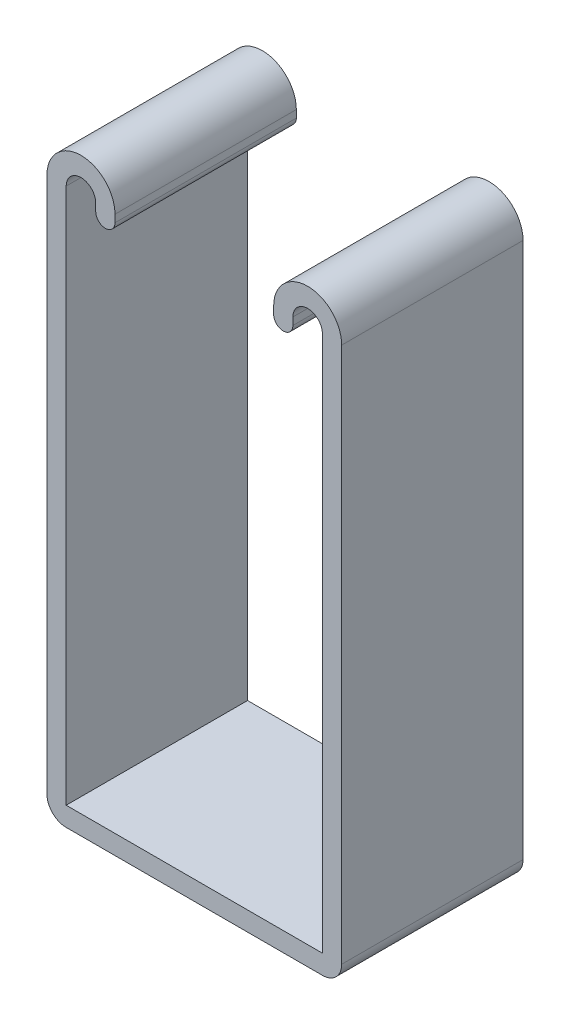
ISO-10303-21;
HEADER;
FILE_DESCRIPTION(('STEP AP214'),'2;1');
FILE_NAME('part.step','',(''),(''),'','','');
FILE_SCHEMA(('AUTOMOTIVE_DESIGN { 1 0 10303 214 1 1 1 1 }'));
ENDSEC;
DATA;
#1=APPLICATION_CONTEXT('core data for automotive mechanical design processes');
#2=APPLICATION_PROTOCOL_DEFINITION('international standard','automotive_design',2000,#1);
#3=PRODUCT_CONTEXT('',#1,'mechanical');
#4=PRODUCT('Part','Part','',(#3));
#5=PRODUCT_RELATED_PRODUCT_CATEGORY('part','',(#4));
#6=PRODUCT_DEFINITION_FORMATION('','',#4);
#7=PRODUCT_DEFINITION_CONTEXT('part definition',#1,'design');
#8=PRODUCT_DEFINITION('design','',#6,#7);
#9=PRODUCT_DEFINITION_SHAPE('','',#8);
#10=(LENGTH_UNIT() NAMED_UNIT(*) SI_UNIT(.MILLI.,.METRE.));
#11=(NAMED_UNIT(*) PLANE_ANGLE_UNIT() SI_UNIT($,.RADIAN.));
#12=(NAMED_UNIT(*) SI_UNIT($,.STERADIAN.) SOLID_ANGLE_UNIT());
#13=UNCERTAINTY_MEASURE_WITH_UNIT(LENGTH_MEASURE(1.E-05),#10,'distance_accuracy_value','');
#14=(GEOMETRIC_REPRESENTATION_CONTEXT(3) GLOBAL_UNCERTAINTY_ASSIGNED_CONTEXT((#13)) GLOBAL_UNIT_ASSIGNED_CONTEXT((#10,
#11,#12)) REPRESENTATION_CONTEXT('',''));
#15=CARTESIAN_POINT('',(0.,0.,0.));
#16=DIRECTION('',(0.,0.,1.));
#17=DIRECTION('',(1.,0.,0.));
#18=AXIS2_PLACEMENT_3D('',#15,#16,#17);
#19=CARTESIAN_POINT('',(-15.875,39.6875,12.7));
#20=DIRECTION('',(0.,0.,-1.));
#21=DIRECTION('',(-1.,0.,0.));
#22=AXIS2_PLACEMENT_3D('',#19,#20,#21);
#23=CYLINDRICAL_SURFACE('',#22,4.7625);
#24=CARTESIAN_POINT('',(-15.875,39.6875,-12.7));
#25=DIRECTION('',(0.,0.,1.));
#26=DIRECTION('',(-1.,0.,0.));
#27=AXIS2_PLACEMENT_3D('',#24,#25,#26);
#28=CIRCLE('',#27,4.7625);
#29=CARTESIAN_POINT('',(-11.1125,39.6875,-12.7));
#30=VERTEX_POINT('',#29);
#31=CARTESIAN_POINT('',(-20.6375,39.6875,-12.7));
#32=VERTEX_POINT('',#31);
#33=EDGE_CURVE('E188',#30,#32,#28,.T.);
#34=ORIENTED_EDGE('',*,*,#33,.T.);
#35=DIRECTION('',(0.,0.,-1.));
#36=VECTOR('',#35,1.);
#37=CARTESIAN_POINT('',(-20.6375,39.6875,12.7));
#38=LINE('',#37,#36);
#39=CARTESIAN_POINT('',(-20.6375,39.6875,12.7));
#40=VERTEX_POINT('',#39);
#41=EDGE_CURVE('E11',#40,#32,#38,.T.);
#42=ORIENTED_EDGE('',*,*,#41,.F.);
#43=CARTESIAN_POINT('',(-15.875,39.6875,12.7));
#44=DIRECTION('',(0.,0.,1.));
#45=DIRECTION('',(-1.,0.,0.));
#46=AXIS2_PLACEMENT_3D('',#43,#44,#45);
#47=CIRCLE('',#46,4.7625);
#48=CARTESIAN_POINT('',(-11.1125,39.6875,12.7));
#49=VERTEX_POINT('',#48);
#50=EDGE_CURVE('E222',#49,#40,#47,.T.);
#51=ORIENTED_EDGE('',*,*,#50,.F.);
#52=DIRECTION('',(0.,0.,-1.));
#53=VECTOR('',#52,1.);
#54=CARTESIAN_POINT('',(-11.1125,39.6875,12.7));
#55=LINE('',#54,#53);
#56=EDGE_CURVE('E184',#49,#30,#55,.T.);
#57=ORIENTED_EDGE('',*,*,#56,.T.);
#58=EDGE_LOOP('',(#34,#42,#51,#57));
#59=FACE_BOUND('',#58,.T.);
#60=ADVANCED_FACE('F32',(#59),#23,.T.);
#61=CARTESIAN_POINT('',(-20.6375,39.6875,12.7));
#62=DIRECTION('',(1.,0.,0.));
#63=DIRECTION('',(0.,1.,0.));
#64=AXIS2_PLACEMENT_3D('',#61,#62,#63);
#65=PLANE('',#64);
#66=DIRECTION('',(0.,-1.,0.));
#67=VECTOR('',#66,1.);
#68=CARTESIAN_POINT('',(-20.6375,39.6875,-12.7));
#69=LINE('',#68,#67);
#70=CARTESIAN_POINT('',(-20.6375,-35.4076,-12.7));
#71=VERTEX_POINT('',#70);
#72=EDGE_CURVE('E191',#32,#71,#69,.T.);
#73=ORIENTED_EDGE('',*,*,#72,.T.);
#74=DIRECTION('',(0.,0.,-1.));
#75=VECTOR('',#74,1.);
#76=CARTESIAN_POINT('',(-20.6375,-35.4076,12.7));
#77=LINE('',#76,#75);
#78=CARTESIAN_POINT('',(-20.6375,-35.4076,12.7));
#79=VERTEX_POINT('',#78);
#80=EDGE_CURVE('E40',#79,#71,#77,.T.);
#81=ORIENTED_EDGE('',*,*,#80,.F.);
#82=DIRECTION('',(0.,-1.,0.));
#83=VECTOR('',#82,1.);
#84=CARTESIAN_POINT('',(-20.6375,39.6875,12.7));
#85=LINE('',#84,#83);
#86=EDGE_CURVE('E121',#40,#79,#85,.T.);
#87=ORIENTED_EDGE('',*,*,#86,.F.);
#88=ORIENTED_EDGE('',*,*,#41,.T.);
#89=EDGE_LOOP('',(#73,#81,#87,#88));
#90=FACE_BOUND('',#89,.T.);
#91=ADVANCED_FACE('F330',(#90),#65,.F.);
#92=CARTESIAN_POINT('',(-17.9451,-35.4076,12.7));
#93=DIRECTION('',(0.,0.,-1.));
#94=DIRECTION('',(-1.,0.,0.));
#95=AXIS2_PLACEMENT_3D('',#92,#93,#94);
#96=CYLINDRICAL_SURFACE('',#95,2.6924);
#97=CARTESIAN_POINT('',(-17.9451,-35.4076,-12.7));
#98=DIRECTION('',(0.,0.,1.));
#99=DIRECTION('',(-1.,0.,0.));
#100=AXIS2_PLACEMENT_3D('',#97,#98,#99);
#101=CIRCLE('',#100,2.6924);
#102=CARTESIAN_POINT('',(-17.9451,-38.1,-12.7));
#103=VERTEX_POINT('',#102);
#104=EDGE_CURVE('E193',#71,#103,#101,.T.);
#105=ORIENTED_EDGE('',*,*,#104,.T.);
#106=DIRECTION('',(0.,0.,-1.));
#107=VECTOR('',#106,1.);
#108=CARTESIAN_POINT('',(-17.9451,-38.1,12.7));
#109=LINE('',#108,#107);
#110=CARTESIAN_POINT('',(-17.9451,-38.1,12.7));
#111=VERTEX_POINT('',#110);
#112=EDGE_CURVE('E259',#111,#103,#109,.T.);
#113=ORIENTED_EDGE('',*,*,#112,.F.);
#114=CARTESIAN_POINT('',(-17.9451,-35.4076,12.7));
#115=DIRECTION('',(0.,0.,1.));
#116=DIRECTION('',(-1.,0.,0.));
#117=AXIS2_PLACEMENT_3D('',#114,#115,#116);
#118=CIRCLE('',#117,2.6924);
#119=EDGE_CURVE('E267',#79,#111,#118,.T.);
#120=ORIENTED_EDGE('',*,*,#119,.F.);
#121=ORIENTED_EDGE('',*,*,#80,.T.);
#122=EDGE_LOOP('',(#105,#113,#120,#121));
#123=FACE_BOUND('',#122,.T.);
#124=ADVANCED_FACE('F265',(#123),#96,.T.);
#125=CARTESIAN_POINT('',(-17.9451,-38.1,12.7));
#126=DIRECTION('',(0.,1.,0.));
#127=DIRECTION('',(-1.,0.,0.));
#128=AXIS2_PLACEMENT_3D('',#125,#126,#127);
#129=PLANE('',#128);
#130=DIRECTION('',(1.,0.,0.));
#131=VECTOR('',#130,1.);
#132=CARTESIAN_POINT('',(-17.9451,-38.1,-12.7));
#133=LINE('',#132,#131);
#134=CARTESIAN_POINT('',(17.9451,-38.1,-12.7));
#135=VERTEX_POINT('',#134);
#136=EDGE_CURVE('E195',#103,#135,#133,.T.);
#137=ORIENTED_EDGE('',*,*,#136,.T.);
#138=DIRECTION('',(0.,0.,-1.));
#139=VECTOR('',#138,1.);
#140=CARTESIAN_POINT('',(17.9451,-38.1,12.7));
#141=LINE('',#140,#139);
#142=CARTESIAN_POINT('',(17.9451,-38.1,12.7));
#143=VERTEX_POINT('',#142);
#144=EDGE_CURVE('E256',#143,#135,#141,.T.);
#145=ORIENTED_EDGE('',*,*,#144,.F.);
#146=DIRECTION('',(1.,0.,0.));
#147=VECTOR('',#146,1.);
#148=CARTESIAN_POINT('',(-17.9451,-38.1,12.7));
#149=LINE('',#148,#147);
#150=EDGE_CURVE('E285',#111,#143,#149,.T.);
#151=ORIENTED_EDGE('',*,*,#150,.F.);
#152=ORIENTED_EDGE('',*,*,#112,.T.);
#153=EDGE_LOOP('',(#137,#145,#151,#152));
#154=FACE_BOUND('',#153,.T.);
#155=ADVANCED_FACE('F276',(#154),#129,.F.);
#156=CARTESIAN_POINT('',(17.9451,-35.4076,12.7));
#157=DIRECTION('',(0.,0.,-1.));
#158=DIRECTION('',(-1.,0.,0.));
#159=AXIS2_PLACEMENT_3D('',#156,#157,#158);
#160=CYLINDRICAL_SURFACE('',#159,2.6924);
#161=CARTESIAN_POINT('',(17.9451,-35.4076,-12.7));
#162=DIRECTION('',(0.,0.,1.));
#163=DIRECTION('',(1.,0.,0.));
#164=AXIS2_PLACEMENT_3D('',#161,#162,#163);
#165=CIRCLE('',#164,2.6924);
#166=CARTESIAN_POINT('',(20.6375,-35.4076,-12.7));
#167=VERTEX_POINT('',#166);
#168=EDGE_CURVE('E197',#135,#167,#165,.T.);
#169=ORIENTED_EDGE('',*,*,#168,.T.);
#170=DIRECTION('',(0.,0.,-1.));
#171=VECTOR('',#170,1.);
#172=CARTESIAN_POINT('',(20.6375,-35.4076,12.7));
#173=LINE('',#172,#171);
#174=CARTESIAN_POINT('',(20.6375,-35.4076,12.7));
#175=VERTEX_POINT('',#174);
#176=EDGE_CURVE('E253',#175,#167,#173,.T.);
#177=ORIENTED_EDGE('',*,*,#176,.F.);
#178=CARTESIAN_POINT('',(17.9451,-35.4076,12.7));
#179=DIRECTION('',(0.,0.,1.));
#180=DIRECTION('',(1.,0.,0.));
#181=AXIS2_PLACEMENT_3D('',#178,#179,#180);
#182=CIRCLE('',#181,2.6924);
#183=EDGE_CURVE('E282',#143,#175,#182,.T.);
#184=ORIENTED_EDGE('',*,*,#183,.F.);
#185=ORIENTED_EDGE('',*,*,#144,.T.);
#186=EDGE_LOOP('',(#169,#177,#184,#185));
#187=FACE_BOUND('',#186,.T.);
#188=ADVANCED_FACE('F280',(#187),#160,.T.);
#189=CARTESIAN_POINT('',(20.6375,-35.4076,12.7));
#190=DIRECTION('',(-1.,0.,0.));
#191=DIRECTION('',(0.,-1.,0.));
#192=AXIS2_PLACEMENT_3D('',#189,#190,#191);
#193=PLANE('',#192);
#194=DIRECTION('',(0.,1.,0.));
#195=VECTOR('',#194,1.);
#196=CARTESIAN_POINT('',(20.6375,-35.4076,-12.7));
#197=LINE('',#196,#195);
#198=CARTESIAN_POINT('',(20.6375,39.6875,-12.7));
#199=VERTEX_POINT('',#198);
#200=EDGE_CURVE('E199',#167,#199,#197,.T.);
#201=ORIENTED_EDGE('',*,*,#200,.T.);
#202=DIRECTION('',(0.,0.,-1.));
#203=VECTOR('',#202,1.);
#204=CARTESIAN_POINT('',(20.6375,39.6875,12.7));
#205=LINE('',#204,#203);
#206=CARTESIAN_POINT('',(20.6375,39.6875,12.7));
#207=VERTEX_POINT('',#206);
#208=EDGE_CURVE('E250',#207,#199,#205,.T.);
#209=ORIENTED_EDGE('',*,*,#208,.F.);
#210=DIRECTION('',(0.,1.,0.));
#211=VECTOR('',#210,1.);
#212=CARTESIAN_POINT('',(20.6375,-35.4076,12.7));
#213=LINE('',#212,#211);
#214=EDGE_CURVE('E284',#175,#207,#213,.T.);
#215=ORIENTED_EDGE('',*,*,#214,.F.);
#216=ORIENTED_EDGE('',*,*,#176,.T.);
#217=EDGE_LOOP('',(#201,#209,#215,#216));
#218=FACE_BOUND('',#217,.T.);
#219=ADVANCED_FACE('F343',(#218),#193,.F.);
#220=CARTESIAN_POINT('',(15.875,39.6875,12.7));
#221=DIRECTION('',(0.,0.,-1.));
#222=DIRECTION('',(-1.,0.,0.));
#223=AXIS2_PLACEMENT_3D('',#220,#221,#222);
#224=CYLINDRICAL_SURFACE('',#223,4.7625);
#225=CARTESIAN_POINT('',(15.875,39.6875,-12.7));
#226=DIRECTION('',(0.,0.,1.));
#227=DIRECTION('',(1.,0.,0.));
#228=AXIS2_PLACEMENT_3D('',#225,#226,#227);
#229=CIRCLE('',#228,4.7625);
#230=CARTESIAN_POINT('',(11.1125,39.6875,-12.7));
#231=VERTEX_POINT('',#230);
#232=EDGE_CURVE('E201',#199,#231,#229,.T.);
#233=ORIENTED_EDGE('',*,*,#232,.T.);
#234=DIRECTION('',(0.,0.,-1.));
#235=VECTOR('',#234,1.);
#236=CARTESIAN_POINT('',(11.1125,39.6875,12.7));
#237=LINE('',#236,#235);
#238=CARTESIAN_POINT('',(11.1125,39.6875,12.7));
#239=VERTEX_POINT('',#238);
#240=EDGE_CURVE('E247',#239,#231,#237,.T.);
#241=ORIENTED_EDGE('',*,*,#240,.F.);
#242=CARTESIAN_POINT('',(15.875,39.6875,12.7));
#243=DIRECTION('',(0.,0.,1.));
#244=DIRECTION('',(1.,0.,0.));
#245=AXIS2_PLACEMENT_3D('',#242,#243,#244);
#246=CIRCLE('',#245,4.7625);
#247=EDGE_CURVE('E287',#207,#239,#246,.T.);
#248=ORIENTED_EDGE('',*,*,#247,.F.);
#249=ORIENTED_EDGE('',*,*,#208,.T.);
#250=EDGE_LOOP('',(#233,#241,#248,#249));
#251=FACE_BOUND('',#250,.T.);
#252=ADVANCED_FACE('F346',(#251),#224,.T.);
#253=CARTESIAN_POINT('',(11.1125,39.6875,12.7));
#254=DIRECTION('',(1.,0.,0.));
#255=DIRECTION('',(0.,1.,0.));
#256=AXIS2_PLACEMENT_3D('',#253,#254,#255);
#257=PLANE('',#256);
#258=DIRECTION('',(0.,-1.,0.));
#259=VECTOR('',#258,1.);
#260=CARTESIAN_POINT('',(11.1125,39.6875,-12.7));
#261=LINE('',#260,#259);
#262=CARTESIAN_POINT('',(11.1125,38.65245,-12.7));
#263=VERTEX_POINT('',#262);
#264=EDGE_CURVE('E203',#231,#263,#261,.T.);
#265=ORIENTED_EDGE('',*,*,#264,.T.);
#266=DIRECTION('',(0.,0.,-1.));
#267=VECTOR('',#266,1.);
#268=CARTESIAN_POINT('',(11.1125,38.65245,12.7));
#269=LINE('',#268,#267);
#270=CARTESIAN_POINT('',(11.1125,38.65245,12.7));
#271=VERTEX_POINT('',#270);
#272=EDGE_CURVE('E244',#271,#263,#269,.T.);
#273=ORIENTED_EDGE('',*,*,#272,.F.);
#274=DIRECTION('',(0.,-1.,0.));
#275=VECTOR('',#274,1.);
#276=CARTESIAN_POINT('',(11.1125,39.6875,12.7));
#277=LINE('',#276,#275);
#278=EDGE_CURVE('E293',#239,#271,#277,.T.);
#279=ORIENTED_EDGE('',*,*,#278,.F.);
#280=ORIENTED_EDGE('',*,*,#240,.T.);
#281=EDGE_LOOP('',(#265,#273,#279,#280));
#282=FACE_BOUND('',#281,.T.);
#283=ADVANCED_FACE('F350',(#282),#257,.F.);
#284=CARTESIAN_POINT('',(12.4587,38.65245,12.7));
#285=DIRECTION('',(0.,0.,-1.));
#286=DIRECTION('',(-1.,0.,0.));
#287=AXIS2_PLACEMENT_3D('',#284,#285,#286);
#288=CYLINDRICAL_SURFACE('',#287,1.3462);
#289=CARTESIAN_POINT('',(12.4587,38.65245,-12.7));
#290=DIRECTION('',(0.,0.,1.));
#291=DIRECTION('',(1.,0.,0.));
#292=AXIS2_PLACEMENT_3D('',#289,#290,#291);
#293=CIRCLE('',#292,1.3462);
#294=CARTESIAN_POINT('',(13.8049,38.65245,-12.7));
#295=VERTEX_POINT('',#294);
#296=EDGE_CURVE('E205',#263,#295,#293,.T.);
#297=ORIENTED_EDGE('',*,*,#296,.T.);
#298=DIRECTION('',(0.,0.,-1.));
#299=VECTOR('',#298,1.);
#300=CARTESIAN_POINT('',(13.8049,38.65245,12.7));
#301=LINE('',#300,#299);
#302=CARTESIAN_POINT('',(13.8049,38.65245,12.7));
#303=VERTEX_POINT('',#302);
#304=EDGE_CURVE('E241',#303,#295,#301,.T.);
#305=ORIENTED_EDGE('',*,*,#304,.F.);
#306=CARTESIAN_POINT('',(12.4587,38.65245,12.7));
#307=DIRECTION('',(0.,0.,1.));
#308=DIRECTION('',(1.,0.,0.));
#309=AXIS2_PLACEMENT_3D('',#306,#307,#308);
#310=CIRCLE('',#309,1.3462);
#311=EDGE_CURVE('E295',#271,#303,#310,.T.);
#312=ORIENTED_EDGE('',*,*,#311,.F.);
#313=ORIENTED_EDGE('',*,*,#272,.T.);
#314=EDGE_LOOP('',(#297,#305,#312,#313));
#315=FACE_BOUND('',#314,.T.);
#316=ADVANCED_FACE('F354',(#315),#288,.T.);
#317=CARTESIAN_POINT('',(13.8049,39.6875,12.7));
#318=DIRECTION('',(-1.,0.,0.));
#319=DIRECTION('',(0.,0.,1.));
#320=AXIS2_PLACEMENT_3D('',#317,#318,#319);
#321=PLANE('',#320);
#322=DIRECTION('',(0.,1.,0.));
#323=VECTOR('',#322,1.);
#324=CARTESIAN_POINT('',(13.8049,39.6875,-12.7));
#325=LINE('',#324,#323);
#326=CARTESIAN_POINT('',(13.8049,39.6875,-12.7));
#327=VERTEX_POINT('',#326);
#328=EDGE_CURVE('E207',#295,#327,#325,.T.);
#329=ORIENTED_EDGE('',*,*,#328,.T.);
#330=DIRECTION('',(0.,0.,-1.));
#331=VECTOR('',#330,1.);
#332=CARTESIAN_POINT('',(13.8049,39.6875,12.7));
#333=LINE('',#332,#331);
#334=CARTESIAN_POINT('',(13.8049,39.6875,12.7));
#335=VERTEX_POINT('',#334);
#336=EDGE_CURVE('E238',#335,#327,#333,.T.);
#337=ORIENTED_EDGE('',*,*,#336,.F.);
#338=DIRECTION('',(0.,1.,0.));
#339=VECTOR('',#338,1.);
#340=CARTESIAN_POINT('',(13.8049,39.6875,12.7));
#341=LINE('',#340,#339);
#342=EDGE_CURVE('E297',#303,#335,#341,.T.);
#343=ORIENTED_EDGE('',*,*,#342,.F.);
#344=ORIENTED_EDGE('',*,*,#304,.T.);
#345=EDGE_LOOP('',(#329,#337,#343,#344));
#346=FACE_BOUND('',#345,.T.);
#347=ADVANCED_FACE('F358',(#346),#321,.F.);
#348=CARTESIAN_POINT('',(15.875,39.6875,12.7));
#349=DIRECTION('',(0.,0.,-1.));
#350=DIRECTION('',(-1.,0.,0.));
#351=AXIS2_PLACEMENT_3D('',#348,#349,#350);
#352=CYLINDRICAL_SURFACE('',#351,2.07010000000001);
#353=CARTESIAN_POINT('',(15.875,39.6875,-12.7));
#354=DIRECTION('',(0.,0.,-1.));
#355=DIRECTION('',(1.,0.,0.));
#356=AXIS2_PLACEMENT_3D('',#353,#354,#355);
#357=CIRCLE('',#356,2.07010000000001);
#358=CARTESIAN_POINT('',(17.9451,39.6875,-12.7));
#359=VERTEX_POINT('',#358);
#360=EDGE_CURVE('E209',#327,#359,#357,.T.);
#361=ORIENTED_EDGE('',*,*,#360,.T.);
#362=DIRECTION('',(0.,0.,-1.));
#363=VECTOR('',#362,1.);
#364=CARTESIAN_POINT('',(17.9451,39.6875,12.7));
#365=LINE('',#364,#363);
#366=CARTESIAN_POINT('',(17.9451,39.6875,12.7));
#367=VERTEX_POINT('',#366);
#368=EDGE_CURVE('E235',#367,#359,#365,.T.);
#369=ORIENTED_EDGE('',*,*,#368,.F.);
#370=CARTESIAN_POINT('',(15.875,39.6875,12.7));
#371=DIRECTION('',(0.,0.,-1.));
#372=DIRECTION('',(1.,0.,0.));
#373=AXIS2_PLACEMENT_3D('',#370,#371,#372);
#374=CIRCLE('',#373,2.07010000000001);
#375=EDGE_CURVE('E299',#335,#367,#374,.T.);
#376=ORIENTED_EDGE('',*,*,#375,.F.);
#377=ORIENTED_EDGE('',*,*,#336,.T.);
#378=EDGE_LOOP('',(#361,#369,#376,#377));
#379=FACE_BOUND('',#378,.T.);
#380=ADVANCED_FACE('F362',(#379),#352,.F.);
#381=CARTESIAN_POINT('',(17.9451,-35.4076,12.7));
#382=DIRECTION('',(1.,0.,0.));
#383=DIRECTION('',(0.,0.,-1.));
#384=AXIS2_PLACEMENT_3D('',#381,#382,#383);
#385=PLANE('',#384);
#386=DIRECTION('',(0.,-1.,0.));
#387=VECTOR('',#386,1.);
#388=CARTESIAN_POINT('',(17.9451,-35.4076,-12.7));
#389=LINE('',#388,#387);
#390=CARTESIAN_POINT('',(17.9451,-35.4076,-12.7));
#391=VERTEX_POINT('',#390);
#392=EDGE_CURVE('E211',#359,#391,#389,.T.);
#393=ORIENTED_EDGE('',*,*,#392,.T.);
#394=DIRECTION('',(0.,0.,-1.));
#395=VECTOR('',#394,1.);
#396=CARTESIAN_POINT('',(17.9451,-35.4076,12.7));
#397=LINE('',#396,#395);
#398=CARTESIAN_POINT('',(17.9451,-35.4076,12.7));
#399=VERTEX_POINT('',#398);
#400=EDGE_CURVE('E232',#399,#391,#397,.T.);
#401=ORIENTED_EDGE('',*,*,#400,.F.);
#402=DIRECTION('',(0.,-1.,0.));
#403=VECTOR('',#402,1.);
#404=CARTESIAN_POINT('',(17.9451,-35.4076,12.7));
#405=LINE('',#404,#403);
#406=EDGE_CURVE('E301',#367,#399,#405,.T.);
#407=ORIENTED_EDGE('',*,*,#406,.F.);
#408=ORIENTED_EDGE('',*,*,#368,.T.);
#409=EDGE_LOOP('',(#393,#401,#407,#408));
#410=FACE_BOUND('',#409,.T.);
#411=ADVANCED_FACE('F366',(#410),#385,.F.);
#412=CARTESIAN_POINT('',(-17.9451,-35.4076,12.7));
#413=DIRECTION('',(0.,-1.,0.));
#414=DIRECTION('',(0.,0.,-1.));
#415=AXIS2_PLACEMENT_3D('',#412,#413,#414);
#416=PLANE('',#415);
#417=DIRECTION('',(-1.,0.,0.));
#418=VECTOR('',#417,1.);
#419=CARTESIAN_POINT('',(-17.9451,-35.4076,-12.7));
#420=LINE('',#419,#418);
#421=CARTESIAN_POINT('',(-17.9451,-35.4076,-12.7));
#422=VERTEX_POINT('',#421);
#423=EDGE_CURVE('E213',#391,#422,#420,.T.);
#424=ORIENTED_EDGE('',*,*,#423,.T.);
#425=DIRECTION('',(0.,0.,-1.));
#426=VECTOR('',#425,1.);
#427=CARTESIAN_POINT('',(-17.9451,-35.4076,12.7));
#428=LINE('',#427,#426);
#429=CARTESIAN_POINT('',(-17.9451,-35.4076,12.7));
#430=VERTEX_POINT('',#429);
#431=EDGE_CURVE('E229',#430,#422,#428,.T.);
#432=ORIENTED_EDGE('',*,*,#431,.F.);
#433=DIRECTION('',(-1.,0.,0.));
#434=VECTOR('',#433,1.);
#435=CARTESIAN_POINT('',(-17.9451,-35.4076,12.7));
#436=LINE('',#435,#434);
#437=EDGE_CURVE('E303',#399,#430,#436,.T.);
#438=ORIENTED_EDGE('',*,*,#437,.F.);
#439=ORIENTED_EDGE('',*,*,#400,.T.);
#440=EDGE_LOOP('',(#424,#432,#438,#439));
#441=FACE_BOUND('',#440,.T.);
#442=ADVANCED_FACE('F370',(#441),#416,.F.);
#443=CARTESIAN_POINT('',(-17.9451,39.6875,12.7));
#444=DIRECTION('',(-1.,0.,0.));
#445=DIRECTION('',(0.,-1.,0.));
#446=AXIS2_PLACEMENT_3D('',#443,#444,#445);
#447=PLANE('',#446);
#448=DIRECTION('',(0.,1.,0.));
#449=VECTOR('',#448,1.);
#450=CARTESIAN_POINT('',(-17.9451,39.6875,-12.7));
#451=LINE('',#450,#449);
#452=CARTESIAN_POINT('',(-17.9451,39.6875,-12.7));
#453=VERTEX_POINT('',#452);
#454=EDGE_CURVE('E215',#422,#453,#451,.T.);
#455=ORIENTED_EDGE('',*,*,#454,.T.);
#456=DIRECTION('',(0.,0.,-1.));
#457=VECTOR('',#456,1.);
#458=CARTESIAN_POINT('',(-17.9451,39.6875,12.7));
#459=LINE('',#458,#457);
#460=CARTESIAN_POINT('',(-17.9451,39.6875,12.7));
#461=VERTEX_POINT('',#460);
#462=EDGE_CURVE('E226',#461,#453,#459,.T.);
#463=ORIENTED_EDGE('',*,*,#462,.F.);
#464=DIRECTION('',(0.,1.,0.));
#465=VECTOR('',#464,1.);
#466=CARTESIAN_POINT('',(-17.9451,39.6875,12.7));
#467=LINE('',#466,#465);
#468=EDGE_CURVE('E305',#430,#461,#467,.T.);
#469=ORIENTED_EDGE('',*,*,#468,.F.);
#470=ORIENTED_EDGE('',*,*,#431,.T.);
#471=EDGE_LOOP('',(#455,#463,#469,#470));
#472=FACE_BOUND('',#471,.T.);
#473=ADVANCED_FACE('F311',(#472),#447,.F.);
#474=CARTESIAN_POINT('',(-15.875,39.6875,12.7));
#475=DIRECTION('',(0.,0.,-1.));
#476=DIRECTION('',(-1.,0.,0.));
#477=AXIS2_PLACEMENT_3D('',#474,#475,#476);
#478=CYLINDRICAL_SURFACE('',#477,2.0701);
#479=CARTESIAN_POINT('',(-15.875,39.6875,-12.7));
#480=DIRECTION('',(0.,0.,-1.));
#481=DIRECTION('',(-1.,0.,0.));
#482=AXIS2_PLACEMENT_3D('',#479,#480,#481);
#483=CIRCLE('',#482,2.0701);
#484=CARTESIAN_POINT('',(-13.8049,39.6875,-12.7));
#485=VERTEX_POINT('',#484);
#486=EDGE_CURVE('E217',#453,#485,#483,.T.);
#487=ORIENTED_EDGE('',*,*,#486,.T.);
#488=DIRECTION('',(0.,0.,-1.));
#489=VECTOR('',#488,1.);
#490=CARTESIAN_POINT('',(-13.8049,39.6875,12.7));
#491=LINE('',#490,#489);
#492=CARTESIAN_POINT('',(-13.8049,39.6875,12.7));
#493=VERTEX_POINT('',#492);
#494=EDGE_CURVE('E179',#493,#485,#491,.T.);
#495=ORIENTED_EDGE('',*,*,#494,.F.);
#496=CARTESIAN_POINT('',(-15.875,39.6875,12.7));
#497=DIRECTION('',(0.,0.,-1.));
#498=DIRECTION('',(-1.,0.,0.));
#499=AXIS2_PLACEMENT_3D('',#496,#497,#498);
#500=CIRCLE('',#499,2.0701);
#501=EDGE_CURVE('E170',#461,#493,#500,.T.);
#502=ORIENTED_EDGE('',*,*,#501,.F.);
#503=ORIENTED_EDGE('',*,*,#462,.T.);
#504=EDGE_LOOP('',(#487,#495,#502,#503));
#505=FACE_BOUND('',#504,.T.);
#506=ADVANCED_FACE('F315',(#505),#478,.F.);
#507=CARTESIAN_POINT('',(-13.8049,39.6875,12.7));
#508=DIRECTION('',(1.,0.,0.));
#509=DIRECTION('',(0.,1.,0.));
#510=AXIS2_PLACEMENT_3D('',#507,#508,#509);
#511=PLANE('',#510);
#512=DIRECTION('',(0.,-1.,0.));
#513=VECTOR('',#512,1.);
#514=CARTESIAN_POINT('',(-13.8049,39.6875,-12.7));
#515=LINE('',#514,#513);
#516=CARTESIAN_POINT('',(-13.8049,38.65245,-12.7));
#517=VERTEX_POINT('',#516);
#518=EDGE_CURVE('E178',#485,#517,#515,.T.);
#519=ORIENTED_EDGE('',*,*,#518,.T.);
#520=DIRECTION('',(0.,0.,-1.));
#521=VECTOR('',#520,1.);
#522=CARTESIAN_POINT('',(-13.8049,38.65245,12.7));
#523=LINE('',#522,#521);
#524=CARTESIAN_POINT('',(-13.8049,38.65245,12.7));
#525=VERTEX_POINT('',#524);
#526=EDGE_CURVE('E175',#525,#517,#523,.T.);
#527=ORIENTED_EDGE('',*,*,#526,.F.);
#528=DIRECTION('',(0.,-1.,0.));
#529=VECTOR('',#528,1.);
#530=CARTESIAN_POINT('',(-13.8049,39.6875,12.7));
#531=LINE('',#530,#529);
#532=EDGE_CURVE('E164',#493,#525,#531,.T.);
#533=ORIENTED_EDGE('',*,*,#532,.F.);
#534=ORIENTED_EDGE('',*,*,#494,.T.);
#535=EDGE_LOOP('',(#519,#527,#533,#534));
#536=FACE_BOUND('',#535,.T.);
#537=ADVANCED_FACE('F176',(#536),#511,.F.);
#538=CARTESIAN_POINT('',(-12.4587,38.65245,12.7));
#539=DIRECTION('',(0.,0.,-1.));
#540=DIRECTION('',(-1.,0.,0.));
#541=AXIS2_PLACEMENT_3D('',#538,#539,#540);
#542=CYLINDRICAL_SURFACE('',#541,1.3462);
#543=CARTESIAN_POINT('',(-12.4587,38.65245,-12.7));
#544=DIRECTION('',(0.,0.,1.));
#545=DIRECTION('',(-1.,0.,0.));
#546=AXIS2_PLACEMENT_3D('',#543,#544,#545);
#547=CIRCLE('',#546,1.3462);
#548=CARTESIAN_POINT('',(-11.1125,38.65245,-12.7));
#549=VERTEX_POINT('',#548);
#550=EDGE_CURVE('E107',#517,#549,#547,.T.);
#551=ORIENTED_EDGE('',*,*,#550,.T.);
#552=DIRECTION('',(0.,0.,-1.));
#553=VECTOR('',#552,1.);
#554=CARTESIAN_POINT('',(-11.1125,38.65245,12.7));
#555=LINE('',#554,#553);
#556=CARTESIAN_POINT('',(-11.1125,38.65245,12.7));
#557=VERTEX_POINT('',#556);
#558=EDGE_CURVE('E180',#557,#549,#555,.T.);
#559=ORIENTED_EDGE('',*,*,#558,.F.);
#560=CARTESIAN_POINT('',(-12.4587,38.65245,12.7));
#561=DIRECTION('',(0.,0.,1.));
#562=DIRECTION('',(-1.,0.,0.));
#563=AXIS2_PLACEMENT_3D('',#560,#561,#562);
#564=CIRCLE('',#563,1.3462);
#565=EDGE_CURVE('E168',#525,#557,#564,.T.);
#566=ORIENTED_EDGE('',*,*,#565,.F.);
#567=ORIENTED_EDGE('',*,*,#526,.T.);
#568=EDGE_LOOP('',(#551,#559,#566,#567));
#569=FACE_BOUND('',#568,.T.);
#570=ADVANCED_FACE('F182',(#569),#542,.T.);
#571=CARTESIAN_POINT('',(-11.1125,39.6875,12.7));
#572=DIRECTION('',(-1.,0.,0.));
#573=DIRECTION('',(0.,-1.,0.));
#574=AXIS2_PLACEMENT_3D('',#571,#572,#573);
#575=PLANE('',#574);
#576=DIRECTION('',(0.,1.,0.));
#577=VECTOR('',#576,1.);
#578=CARTESIAN_POINT('',(-11.1125,39.6875,-12.7));
#579=LINE('',#578,#577);
#580=EDGE_CURVE('E113',#549,#30,#579,.T.);
#581=ORIENTED_EDGE('',*,*,#580,.T.);
#582=ORIENTED_EDGE('',*,*,#56,.F.);
#583=DIRECTION('',(0.,1.,0.));
#584=VECTOR('',#583,1.);
#585=CARTESIAN_POINT('',(-11.1125,39.6875,12.7));
#586=LINE('',#585,#584);
#587=EDGE_CURVE('E48',#557,#49,#586,.T.);
#588=ORIENTED_EDGE('',*,*,#587,.F.);
#589=ORIENTED_EDGE('',*,*,#558,.T.);
#590=EDGE_LOOP('',(#581,#582,#588,#589));
#591=FACE_BOUND('',#590,.T.);
#592=ADVANCED_FACE('F319',(#591),#575,.F.);
#593=CARTESIAN_POINT('',(-15.875,39.6875,12.7));
#594=DIRECTION('',(0.,0.,-1.));
#595=DIRECTION('',(-1.,0.,0.));
#596=AXIS2_PLACEMENT_3D('',#593,#594,#595);
#597=PLANE('',#596);
#598=ORIENTED_EDGE('',*,*,#50,.T.);
#599=ORIENTED_EDGE('',*,*,#86,.T.);
#600=ORIENTED_EDGE('',*,*,#119,.T.);
#601=ORIENTED_EDGE('',*,*,#150,.T.);
#602=ORIENTED_EDGE('',*,*,#183,.T.);
#603=ORIENTED_EDGE('',*,*,#214,.T.);
#604=ORIENTED_EDGE('',*,*,#247,.T.);
#605=ORIENTED_EDGE('',*,*,#278,.T.);
#606=ORIENTED_EDGE('',*,*,#311,.T.);
#607=ORIENTED_EDGE('',*,*,#342,.T.);
#608=ORIENTED_EDGE('',*,*,#375,.T.);
#609=ORIENTED_EDGE('',*,*,#406,.T.);
#610=ORIENTED_EDGE('',*,*,#437,.T.);
#611=ORIENTED_EDGE('',*,*,#468,.T.);
#612=ORIENTED_EDGE('',*,*,#501,.T.);
#613=ORIENTED_EDGE('',*,*,#532,.T.);
#614=ORIENTED_EDGE('',*,*,#565,.T.);
#615=ORIENTED_EDGE('',*,*,#587,.T.);
#616=EDGE_LOOP('',(#598,#599,#600,#601,#602,#603,#604,#605,#606,#607,#608,#609,#610,#611,#612,
#613,#614,#615));
#617=FACE_BOUND('',#616,.T.);
#618=ADVANCED_FACE('F166',(#617),#597,.F.);
#619=CARTESIAN_POINT('',(-15.875,39.6875,-12.7));
#620=DIRECTION('',(0.,0.,-1.));
#621=DIRECTION('',(-1.,0.,0.));
#622=AXIS2_PLACEMENT_3D('',#619,#620,#621);
#623=PLANE('',#622);
#624=ORIENTED_EDGE('',*,*,#33,.F.);
#625=ORIENTED_EDGE('',*,*,#580,.F.);
#626=ORIENTED_EDGE('',*,*,#550,.F.);
#627=ORIENTED_EDGE('',*,*,#518,.F.);
#628=ORIENTED_EDGE('',*,*,#486,.F.);
#629=ORIENTED_EDGE('',*,*,#454,.F.);
#630=ORIENTED_EDGE('',*,*,#423,.F.);
#631=ORIENTED_EDGE('',*,*,#392,.F.);
#632=ORIENTED_EDGE('',*,*,#360,.F.);
#633=ORIENTED_EDGE('',*,*,#328,.F.);
#634=ORIENTED_EDGE('',*,*,#296,.F.);
#635=ORIENTED_EDGE('',*,*,#264,.F.);
#636=ORIENTED_EDGE('',*,*,#232,.F.);
#637=ORIENTED_EDGE('',*,*,#200,.F.);
#638=ORIENTED_EDGE('',*,*,#168,.F.);
#639=ORIENTED_EDGE('',*,*,#136,.F.);
#640=ORIENTED_EDGE('',*,*,#104,.F.);
#641=ORIENTED_EDGE('',*,*,#72,.F.);
#642=EDGE_LOOP('',(#624,#625,#626,#627,#628,#629,#630,#631,#632,#633,#634,#635,#636,#637,#638,
#639,#640,#641));
#643=FACE_BOUND('',#642,.T.);
#644=ADVANCED_FACE('F271',(#643),#623,.T.);
#645=CLOSED_SHELL('',(#60,#91,#124,#155,#188,#219,#252,#283,#316,#347,#380,#411,#442,#473,#506,
#537,#570,#592,#618,#644));
#646=MANIFOLD_SOLID_BREP('B2',#645);
#647=ADVANCED_BREP_SHAPE_REPRESENTATION('',(#18,#646),#14);
#648=SHAPE_DEFINITION_REPRESENTATION(#9,#647);
ENDSEC;
END-ISO-10303-21;
